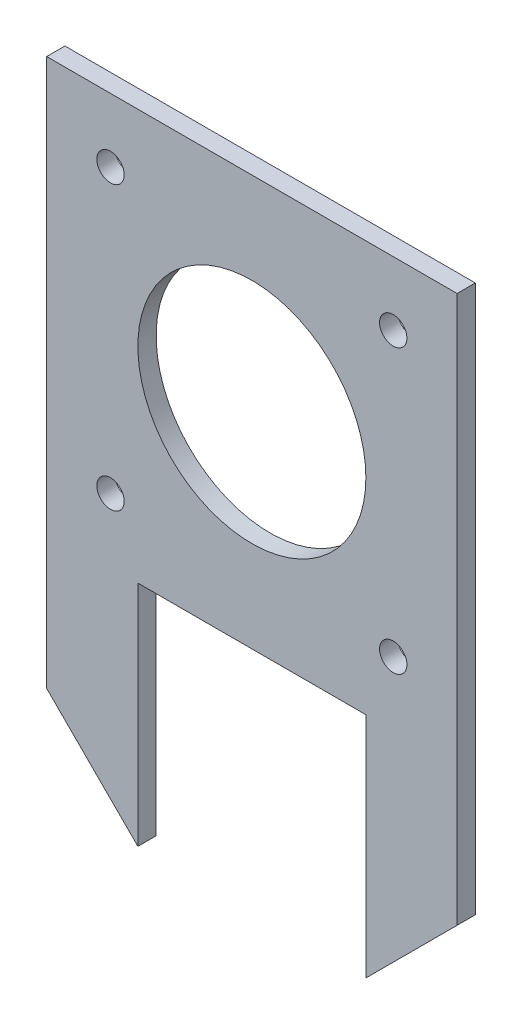
ISO-10303-21;
HEADER;
FILE_DESCRIPTION(('STEP AP214'),'2;1');
FILE_NAME('part.step','',(''),(''),'','','');
FILE_SCHEMA(('AUTOMOTIVE_DESIGN { 1 0 10303 214 1 1 1 1 }'));
ENDSEC;
DATA;
#1=APPLICATION_CONTEXT('core data for automotive mechanical design processes');
#2=APPLICATION_PROTOCOL_DEFINITION('international standard','automotive_design',2000,#1);
#3=PRODUCT_CONTEXT('',#1,'mechanical');
#4=PRODUCT('Part','Part','',(#3));
#5=PRODUCT_RELATED_PRODUCT_CATEGORY('part','',(#4));
#6=PRODUCT_DEFINITION_FORMATION('','',#4);
#7=PRODUCT_DEFINITION_CONTEXT('part definition',#1,'design');
#8=PRODUCT_DEFINITION('design','',#6,#7);
#9=PRODUCT_DEFINITION_SHAPE('','',#8);
#10=(LENGTH_UNIT() NAMED_UNIT(*) SI_UNIT(.MILLI.,.METRE.));
#11=(NAMED_UNIT(*) PLANE_ANGLE_UNIT() SI_UNIT($,.RADIAN.));
#12=(NAMED_UNIT(*) SI_UNIT($,.STERADIAN.) SOLID_ANGLE_UNIT());
#13=UNCERTAINTY_MEASURE_WITH_UNIT(LENGTH_MEASURE(1.E-05),#10,'distance_accuracy_value','');
#14=(GEOMETRIC_REPRESENTATION_CONTEXT(3) GLOBAL_UNCERTAINTY_ASSIGNED_CONTEXT((#13)) GLOBAL_UNIT_ASSIGNED_CONTEXT((#10,
#11,#12)) REPRESENTATION_CONTEXT('',''));
#15=CARTESIAN_POINT('',(0.,0.,0.));
#16=DIRECTION('',(0.,0.,1.));
#17=DIRECTION('',(1.,0.,0.));
#18=AXIS2_PLACEMENT_3D('',#15,#16,#17);
#19=CARTESIAN_POINT('',(-35.,0.,2.));
#20=DIRECTION('',(-1.,0.,0.));
#21=DIRECTION('',(0.,0.,1.));
#22=AXIS2_PLACEMENT_3D('',#19,#20,#21);
#23=PLANE('',#22);
#24=DIRECTION('',(0.,1.,0.));
#25=VECTOR('',#24,1.);
#26=CARTESIAN_POINT('',(-35.,0.,0.));
#27=LINE('',#26,#25);
#28=CARTESIAN_POINT('',(-35.,9.99999999999997,0.));
#29=VERTEX_POINT('',#28);
#30=CARTESIAN_POINT('',(-35.,70.,0.));
#31=VERTEX_POINT('',#30);
#32=EDGE_CURVE('E144',#29,#31,#27,.T.);
#33=ORIENTED_EDGE('',*,*,#32,.F.);
#34=DIRECTION('',(0.,0.,-1.));
#35=VECTOR('',#34,1.);
#36=CARTESIAN_POINT('',(-35.,9.99999999999997,2.));
#37=LINE('',#36,#35);
#38=CARTESIAN_POINT('',(-35.,9.99999999999997,2.));
#39=VERTEX_POINT('',#38);
#40=EDGE_CURVE('E11',#39,#29,#37,.T.);
#41=ORIENTED_EDGE('',*,*,#40,.F.);
#42=DIRECTION('',(0.,1.,0.));
#43=VECTOR('',#42,1.);
#44=CARTESIAN_POINT('',(-35.,0.,2.));
#45=LINE('',#44,#43);
#46=CARTESIAN_POINT('',(-35.,70.,2.));
#47=VERTEX_POINT('',#46);
#48=EDGE_CURVE('E342',#39,#47,#45,.T.);
#49=ORIENTED_EDGE('',*,*,#48,.T.);
#50=DIRECTION('',(0.,0.,-1.));
#51=VECTOR('',#50,1.);
#52=CARTESIAN_POINT('',(-35.,70.,2.));
#53=LINE('',#52,#51);
#54=EDGE_CURVE('E52',#47,#31,#53,.T.);
#55=ORIENTED_EDGE('',*,*,#54,.T.);
#56=EDGE_LOOP('',(#33,#41,#49,#55));
#57=FACE_BOUND('',#56,.T.);
#58=ADVANCED_FACE('F35',(#57),#23,.T.);
#59=CARTESIAN_POINT('',(-12.5,-12.5,2.));
#60=DIRECTION('',(-0.707106781186546,-0.707106781186549,0.));
#61=DIRECTION('',(0.707106781186549,-0.707106781186546,0.));
#62=AXIS2_PLACEMENT_3D('',#59,#60,#61);
#63=PLANE('',#62);
#64=DIRECTION('',(-0.707106781186549,0.707106781186546,0.));
#65=VECTOR('',#64,1.);
#66=CARTESIAN_POINT('',(-12.5,-12.5,0.));
#67=LINE('',#66,#65);
#68=CARTESIAN_POINT('',(-25.,0.,0.));
#69=VERTEX_POINT('',#68);
#70=EDGE_CURVE('E146',#69,#29,#67,.T.);
#71=ORIENTED_EDGE('',*,*,#70,.F.);
#72=DIRECTION('',(0.,0.,-1.));
#73=VECTOR('',#72,1.);
#74=CARTESIAN_POINT('',(-25.,0.,2.));
#75=LINE('',#74,#73);
#76=CARTESIAN_POINT('',(-25.,0.,2.));
#77=VERTEX_POINT('',#76);
#78=EDGE_CURVE('E44',#77,#69,#75,.T.);
#79=ORIENTED_EDGE('',*,*,#78,.F.);
#80=DIRECTION('',(-0.707106781186549,0.707106781186546,0.));
#81=VECTOR('',#80,1.);
#82=CARTESIAN_POINT('',(-12.5,-12.5,2.));
#83=LINE('',#82,#81);
#84=EDGE_CURVE('E185',#77,#39,#83,.T.);
#85=ORIENTED_EDGE('',*,*,#84,.T.);
#86=ORIENTED_EDGE('',*,*,#40,.T.);
#87=EDGE_LOOP('',(#71,#79,#85,#86));
#88=FACE_BOUND('',#87,.T.);
#89=ADVANCED_FACE('F184',(#88),#63,.T.);
#90=CARTESIAN_POINT('',(-25.,0.,2.));
#91=DIRECTION('',(-1.,0.,0.));
#92=DIRECTION('',(0.,0.,1.));
#93=AXIS2_PLACEMENT_3D('',#90,#91,#92);
#94=PLANE('',#93);
#95=DIRECTION('',(0.,1.,0.));
#96=VECTOR('',#95,1.);
#97=CARTESIAN_POINT('',(-25.,0.,0.));
#98=LINE('',#97,#96);
#99=CARTESIAN_POINT('',(-25.,25.,0.));
#100=VERTEX_POINT('',#99);
#101=EDGE_CURVE('E149',#69,#100,#98,.T.);
#102=ORIENTED_EDGE('',*,*,#101,.T.);
#103=DIRECTION('',(0.,0.,-1.));
#104=VECTOR('',#103,1.);
#105=CARTESIAN_POINT('',(-25.,25.,2.));
#106=LINE('',#105,#104);
#107=CARTESIAN_POINT('',(-25.,25.,2.));
#108=VERTEX_POINT('',#107);
#109=EDGE_CURVE('E170',#108,#100,#106,.T.);
#110=ORIENTED_EDGE('',*,*,#109,.F.);
#111=DIRECTION('',(0.,1.,0.));
#112=VECTOR('',#111,1.);
#113=CARTESIAN_POINT('',(-25.,0.,2.));
#114=LINE('',#113,#112);
#115=EDGE_CURVE('E176',#77,#108,#114,.T.);
#116=ORIENTED_EDGE('',*,*,#115,.F.);
#117=ORIENTED_EDGE('',*,*,#78,.T.);
#118=EDGE_LOOP('',(#102,#110,#116,#117));
#119=FACE_BOUND('',#118,.T.);
#120=ADVANCED_FACE('F174',(#119),#94,.F.);
#121=CARTESIAN_POINT('',(0.,25.,2.));
#122=DIRECTION('',(0.,-1.,0.));
#123=DIRECTION('',(1.,0.,0.));
#124=AXIS2_PLACEMENT_3D('',#121,#122,#123);
#125=PLANE('',#124);
#126=DIRECTION('',(-1.,0.,0.));
#127=VECTOR('',#126,1.);
#128=CARTESIAN_POINT('',(0.,25.,0.));
#129=LINE('',#128,#127);
#130=CARTESIAN_POINT('',(0.,25.,0.));
#131=VERTEX_POINT('',#130);
#132=EDGE_CURVE('E152',#131,#100,#129,.T.);
#133=ORIENTED_EDGE('',*,*,#132,.F.);
#134=DIRECTION('',(0.,0.,-1.));
#135=VECTOR('',#134,1.);
#136=CARTESIAN_POINT('',(0.,25.,2.));
#137=LINE('',#136,#135);
#138=CARTESIAN_POINT('',(0.,25.,2.));
#139=VERTEX_POINT('',#138);
#140=EDGE_CURVE('E168',#139,#131,#137,.T.);
#141=ORIENTED_EDGE('',*,*,#140,.F.);
#142=DIRECTION('',(-1.,0.,0.));
#143=VECTOR('',#142,1.);
#144=CARTESIAN_POINT('',(0.,25.,2.));
#145=LINE('',#144,#143);
#146=EDGE_CURVE('E337',#139,#108,#145,.T.);
#147=ORIENTED_EDGE('',*,*,#146,.T.);
#148=ORIENTED_EDGE('',*,*,#109,.T.);
#149=EDGE_LOOP('',(#133,#141,#147,#148));
#150=FACE_BOUND('',#149,.T.);
#151=ADVANCED_FACE('F304',(#150),#125,.T.);
#152=CARTESIAN_POINT('',(0.,0.,2.));
#153=DIRECTION('',(-1.,0.,0.));
#154=DIRECTION('',(0.,0.,1.));
#155=AXIS2_PLACEMENT_3D('',#152,#153,#154);
#156=PLANE('',#155);
#157=DIRECTION('',(0.,1.,0.));
#158=VECTOR('',#157,1.);
#159=CARTESIAN_POINT('',(0.,0.,0.));
#160=LINE('',#159,#158);
#161=CARTESIAN_POINT('',(0.,0.,0.));
#162=VERTEX_POINT('',#161);
#163=EDGE_CURVE('E155',#162,#131,#160,.T.);
#164=ORIENTED_EDGE('',*,*,#163,.F.);
#165=DIRECTION('',(0.,0.,-1.));
#166=VECTOR('',#165,1.);
#167=CARTESIAN_POINT('',(0.,0.,2.));
#168=LINE('',#167,#166);
#169=CARTESIAN_POINT('',(0.,0.,2.));
#170=VERTEX_POINT('',#169);
#171=EDGE_CURVE('E111',#170,#162,#168,.T.);
#172=ORIENTED_EDGE('',*,*,#171,.F.);
#173=DIRECTION('',(0.,1.,0.));
#174=VECTOR('',#173,1.);
#175=CARTESIAN_POINT('',(0.,0.,2.));
#176=LINE('',#175,#174);
#177=EDGE_CURVE('E121',#170,#139,#176,.T.);
#178=ORIENTED_EDGE('',*,*,#177,.T.);
#179=ORIENTED_EDGE('',*,*,#140,.T.);
#180=EDGE_LOOP('',(#164,#172,#178,#179));
#181=FACE_BOUND('',#180,.T.);
#182=ADVANCED_FACE('F295',(#181),#156,.T.);
#183=CARTESIAN_POINT('',(0.,0.,2.));
#184=DIRECTION('',(0.707106781186551,-0.707106781186544,0.));
#185=DIRECTION('',(0.707106781186544,0.707106781186551,0.));
#186=AXIS2_PLACEMENT_3D('',#183,#184,#185);
#187=PLANE('',#186);
#188=DIRECTION('',(-0.707106781186544,-0.707106781186551,0.));
#189=VECTOR('',#188,1.);
#190=CARTESIAN_POINT('',(0.,0.,0.));
#191=LINE('',#190,#189);
#192=CARTESIAN_POINT('',(10.,10.0000000000001,0.));
#193=VERTEX_POINT('',#192);
#194=EDGE_CURVE('E107',#193,#162,#191,.T.);
#195=ORIENTED_EDGE('',*,*,#194,.F.);
#196=DIRECTION('',(0.,0.,-1.));
#197=VECTOR('',#196,1.);
#198=CARTESIAN_POINT('',(10.,10.0000000000001,2.));
#199=LINE('',#198,#197);
#200=CARTESIAN_POINT('',(10.,10.0000000000001,2.));
#201=VERTEX_POINT('',#200);
#202=EDGE_CURVE('E102',#201,#193,#199,.T.);
#203=ORIENTED_EDGE('',*,*,#202,.F.);
#204=DIRECTION('',(-0.707106781186544,-0.707106781186551,0.));
#205=VECTOR('',#204,1.);
#206=CARTESIAN_POINT('',(0.,0.,2.));
#207=LINE('',#206,#205);
#208=EDGE_CURVE('E105',#201,#170,#207,.T.);
#209=ORIENTED_EDGE('',*,*,#208,.T.);
#210=ORIENTED_EDGE('',*,*,#171,.T.);
#211=EDGE_LOOP('',(#195,#203,#209,#210));
#212=FACE_BOUND('',#211,.T.);
#213=ADVANCED_FACE('F104',(#212),#187,.T.);
#214=CARTESIAN_POINT('',(10.,0.,2.));
#215=DIRECTION('',(1.,0.,0.));
#216=DIRECTION('',(0.,1.,0.));
#217=AXIS2_PLACEMENT_3D('',#214,#215,#216);
#218=PLANE('',#217);
#219=DIRECTION('',(0.,-1.,0.));
#220=VECTOR('',#219,1.);
#221=CARTESIAN_POINT('',(10.,0.,0.));
#222=LINE('',#221,#220);
#223=CARTESIAN_POINT('',(9.99999999999999,70.,0.));
#224=VERTEX_POINT('',#223);
#225=EDGE_CURVE('E159',#224,#193,#222,.T.);
#226=ORIENTED_EDGE('',*,*,#225,.F.);
#227=DIRECTION('',(0.,0.,-1.));
#228=VECTOR('',#227,1.);
#229=CARTESIAN_POINT('',(9.99999999999999,70.,2.));
#230=LINE('',#229,#228);
#231=CARTESIAN_POINT('',(9.99999999999999,70.,2.));
#232=VERTEX_POINT('',#231);
#233=EDGE_CURVE('E77',#232,#224,#230,.T.);
#234=ORIENTED_EDGE('',*,*,#233,.F.);
#235=DIRECTION('',(0.,-1.,0.));
#236=VECTOR('',#235,1.);
#237=CARTESIAN_POINT('',(10.,0.,2.));
#238=LINE('',#237,#236);
#239=EDGE_CURVE('E118',#232,#201,#238,.T.);
#240=ORIENTED_EDGE('',*,*,#239,.T.);
#241=ORIENTED_EDGE('',*,*,#202,.T.);
#242=EDGE_LOOP('',(#226,#234,#240,#241));
#243=FACE_BOUND('',#242,.T.);
#244=ADVANCED_FACE('F123',(#243),#218,.T.);
#245=CARTESIAN_POINT('',(-12.5,47.5,2.));
#246=DIRECTION('',(0.,0.,-1.));
#247=DIRECTION('',(-1.,0.,0.));
#248=AXIS2_PLACEMENT_3D('',#245,#246,#247);
#249=CYLINDRICAL_SURFACE('',#248,12.5);
#250=CARTESIAN_POINT('',(-12.5,47.5,2.));
#251=DIRECTION('',(0.,0.,1.));
#252=DIRECTION('',(1.,0.,0.));
#253=AXIS2_PLACEMENT_3D('',#250,#251,#252);
#254=CIRCLE('',#253,12.5);
#255=CARTESIAN_POINT('',(0.,47.5,2.));
#256=VERTEX_POINT('',#255);
#257=EDGE_CURVE('E344',#256,#256,#254,.T.);
#258=ORIENTED_EDGE('',*,*,#257,.T.);
#259=EDGE_LOOP('',(#258));
#260=FACE_BOUND('',#259,.T.);
#261=CARTESIAN_POINT('',(-12.5,47.5,0.));
#262=DIRECTION('',(0.,0.,1.));
#263=DIRECTION('',(1.,0.,0.));
#264=AXIS2_PLACEMENT_3D('',#261,#262,#263);
#265=CIRCLE('',#264,12.5);
#266=CARTESIAN_POINT('',(0.,47.5,0.));
#267=VERTEX_POINT('',#266);
#268=EDGE_CURVE('E141',#267,#267,#265,.T.);
#269=ORIENTED_EDGE('',*,*,#268,.F.);
#270=EDGE_LOOP('',(#269));
#271=FACE_BOUND('',#270,.T.);
#272=ADVANCED_FACE('F207',(#260,#271),#249,.F.);
#273=CARTESIAN_POINT('',(-28.,63.,2.));
#274=DIRECTION('',(0.,0.,-1.));
#275=DIRECTION('',(-1.,0.,0.));
#276=AXIS2_PLACEMENT_3D('',#273,#274,#275);
#277=CYLINDRICAL_SURFACE('',#276,1.5);
#278=CARTESIAN_POINT('',(-28.,63.,2.));
#279=DIRECTION('',(0.,0.,1.));
#280=DIRECTION('',(1.,0.,0.));
#281=AXIS2_PLACEMENT_3D('',#278,#279,#280);
#282=CIRCLE('',#281,1.5);
#283=CARTESIAN_POINT('',(-26.5,63.,2.));
#284=VERTEX_POINT('',#283);
#285=EDGE_CURVE('E347',#284,#284,#282,.T.);
#286=ORIENTED_EDGE('',*,*,#285,.T.);
#287=EDGE_LOOP('',(#286));
#288=FACE_BOUND('',#287,.T.);
#289=CARTESIAN_POINT('',(-28.,63.,0.));
#290=DIRECTION('',(0.,0.,1.));
#291=DIRECTION('',(1.,0.,0.));
#292=AXIS2_PLACEMENT_3D('',#289,#290,#291);
#293=CIRCLE('',#292,1.5);
#294=CARTESIAN_POINT('',(-26.5,63.,0.));
#295=VERTEX_POINT('',#294);
#296=EDGE_CURVE('E138',#295,#295,#293,.T.);
#297=ORIENTED_EDGE('',*,*,#296,.F.);
#298=EDGE_LOOP('',(#297));
#299=FACE_BOUND('',#298,.T.);
#300=ADVANCED_FACE('F210',(#288,#299),#277,.F.);
#301=CARTESIAN_POINT('',(3.,63.,2.));
#302=DIRECTION('',(0.,0.,-1.));
#303=DIRECTION('',(-1.,0.,0.));
#304=AXIS2_PLACEMENT_3D('',#301,#302,#303);
#305=CYLINDRICAL_SURFACE('',#304,1.5);
#306=CARTESIAN_POINT('',(3.,63.,2.));
#307=DIRECTION('',(0.,0.,1.));
#308=DIRECTION('',(1.,0.,0.));
#309=AXIS2_PLACEMENT_3D('',#306,#307,#308);
#310=CIRCLE('',#309,1.5);
#311=CARTESIAN_POINT('',(4.5,63.,2.));
#312=VERTEX_POINT('',#311);
#313=EDGE_CURVE('E350',#312,#312,#310,.T.);
#314=ORIENTED_EDGE('',*,*,#313,.T.);
#315=EDGE_LOOP('',(#314));
#316=FACE_BOUND('',#315,.T.);
#317=CARTESIAN_POINT('',(3.,63.,0.));
#318=DIRECTION('',(0.,0.,1.));
#319=DIRECTION('',(1.,0.,0.));
#320=AXIS2_PLACEMENT_3D('',#317,#318,#319);
#321=CIRCLE('',#320,1.5);
#322=CARTESIAN_POINT('',(4.5,63.,0.));
#323=VERTEX_POINT('',#322);
#324=EDGE_CURVE('E135',#323,#323,#321,.T.);
#325=ORIENTED_EDGE('',*,*,#324,.F.);
#326=EDGE_LOOP('',(#325));
#327=FACE_BOUND('',#326,.T.);
#328=ADVANCED_FACE('F214',(#316,#327),#305,.F.);
#329=CARTESIAN_POINT('',(2.99999999999999,32.,2.));
#330=DIRECTION('',(0.,0.,-1.));
#331=DIRECTION('',(-1.,0.,0.));
#332=AXIS2_PLACEMENT_3D('',#329,#330,#331);
#333=CYLINDRICAL_SURFACE('',#332,1.5);
#334=CARTESIAN_POINT('',(2.99999999999999,32.,2.));
#335=DIRECTION('',(0.,0.,1.));
#336=DIRECTION('',(1.,0.,0.));
#337=AXIS2_PLACEMENT_3D('',#334,#335,#336);
#338=CIRCLE('',#337,1.5);
#339=CARTESIAN_POINT('',(4.49999999999999,32.,2.));
#340=VERTEX_POINT('',#339);
#341=EDGE_CURVE('E225',#340,#340,#338,.T.);
#342=ORIENTED_EDGE('',*,*,#341,.T.);
#343=EDGE_LOOP('',(#342));
#344=FACE_BOUND('',#343,.T.);
#345=CARTESIAN_POINT('',(2.99999999999999,32.,0.));
#346=DIRECTION('',(0.,0.,1.));
#347=DIRECTION('',(1.,0.,0.));
#348=AXIS2_PLACEMENT_3D('',#345,#346,#347);
#349=CIRCLE('',#348,1.5);
#350=CARTESIAN_POINT('',(4.49999999999999,32.,0.));
#351=VERTEX_POINT('',#350);
#352=EDGE_CURVE('E132',#351,#351,#349,.T.);
#353=ORIENTED_EDGE('',*,*,#352,.F.);
#354=EDGE_LOOP('',(#353));
#355=FACE_BOUND('',#354,.T.);
#356=ADVANCED_FACE('F195',(#344,#355),#333,.F.);
#357=CARTESIAN_POINT('',(-28.,32.,2.));
#358=DIRECTION('',(0.,0.,-1.));
#359=DIRECTION('',(-1.,0.,0.));
#360=AXIS2_PLACEMENT_3D('',#357,#358,#359);
#361=CYLINDRICAL_SURFACE('',#360,1.5);
#362=CARTESIAN_POINT('',(-28.,32.,2.));
#363=DIRECTION('',(0.,0.,1.));
#364=DIRECTION('',(1.,0.,0.));
#365=AXIS2_PLACEMENT_3D('',#362,#363,#364);
#366=CIRCLE('',#365,1.5);
#367=CARTESIAN_POINT('',(-26.5,32.,2.));
#368=VERTEX_POINT('',#367);
#369=EDGE_CURVE('E164',#368,#368,#366,.T.);
#370=ORIENTED_EDGE('',*,*,#369,.T.);
#371=EDGE_LOOP('',(#370));
#372=FACE_BOUND('',#371,.T.);
#373=CARTESIAN_POINT('',(-28.,32.,0.));
#374=DIRECTION('',(0.,0.,1.));
#375=DIRECTION('',(1.,0.,0.));
#376=AXIS2_PLACEMENT_3D('',#373,#374,#375);
#377=CIRCLE('',#376,1.5);
#378=CARTESIAN_POINT('',(-26.5,32.,0.));
#379=VERTEX_POINT('',#378);
#380=EDGE_CURVE('E129',#379,#379,#377,.T.);
#381=ORIENTED_EDGE('',*,*,#380,.F.);
#382=EDGE_LOOP('',(#381));
#383=FACE_BOUND('',#382,.T.);
#384=ADVANCED_FACE('F37',(#372,#383),#361,.F.);
#385=CARTESIAN_POINT('',(0.,70.,2.));
#386=DIRECTION('',(0.,1.,0.));
#387=DIRECTION('',(0.,0.,1.));
#388=AXIS2_PLACEMENT_3D('',#385,#386,#387);
#389=PLANE('',#388);
#390=DIRECTION('',(1.,0.,0.));
#391=VECTOR('',#390,1.);
#392=CARTESIAN_POINT('',(0.,70.,0.));
#393=LINE('',#392,#391);
#394=EDGE_CURVE('E161',#31,#224,#393,.T.);
#395=ORIENTED_EDGE('',*,*,#394,.F.);
#396=ORIENTED_EDGE('',*,*,#54,.F.);
#397=DIRECTION('',(1.,0.,0.));
#398=VECTOR('',#397,1.);
#399=CARTESIAN_POINT('',(0.,70.,2.));
#400=LINE('',#399,#398);
#401=EDGE_CURVE('E124',#47,#232,#400,.T.);
#402=ORIENTED_EDGE('',*,*,#401,.T.);
#403=ORIENTED_EDGE('',*,*,#233,.T.);
#404=EDGE_LOOP('',(#395,#396,#402,#403));
#405=FACE_BOUND('',#404,.T.);
#406=ADVANCED_FACE('F186',(#405),#389,.T.);
#407=CARTESIAN_POINT('',(0.,0.,2.));
#408=DIRECTION('',(0.,0.,1.));
#409=DIRECTION('',(1.,0.,0.));
#410=AXIS2_PLACEMENT_3D('',#407,#408,#409);
#411=PLANE('',#410);
#412=ORIENTED_EDGE('',*,*,#369,.F.);
#413=EDGE_LOOP('',(#412));
#414=FACE_BOUND('',#413,.T.);
#415=ORIENTED_EDGE('',*,*,#341,.F.);
#416=EDGE_LOOP('',(#415));
#417=FACE_BOUND('',#416,.T.);
#418=ORIENTED_EDGE('',*,*,#313,.F.);
#419=EDGE_LOOP('',(#418));
#420=FACE_BOUND('',#419,.T.);
#421=ORIENTED_EDGE('',*,*,#285,.F.);
#422=EDGE_LOOP('',(#421));
#423=FACE_BOUND('',#422,.T.);
#424=ORIENTED_EDGE('',*,*,#257,.F.);
#425=EDGE_LOOP('',(#424));
#426=FACE_BOUND('',#425,.T.);
#427=ORIENTED_EDGE('',*,*,#48,.F.);
#428=ORIENTED_EDGE('',*,*,#84,.F.);
#429=ORIENTED_EDGE('',*,*,#115,.T.);
#430=ORIENTED_EDGE('',*,*,#146,.F.);
#431=ORIENTED_EDGE('',*,*,#177,.F.);
#432=ORIENTED_EDGE('',*,*,#208,.F.);
#433=ORIENTED_EDGE('',*,*,#239,.F.);
#434=ORIENTED_EDGE('',*,*,#401,.F.);
#435=EDGE_LOOP('',(#427,#428,#429,#430,#431,#432,#433,#434));
#436=FACE_BOUND('',#435,.T.);
#437=ADVANCED_FACE('F116',(#414,#417,#420,#423,#426,#436),#411,.T.);
#438=CARTESIAN_POINT('',(0.,0.,0.));
#439=DIRECTION('',(0.,0.,1.));
#440=DIRECTION('',(1.,0.,0.));
#441=AXIS2_PLACEMENT_3D('',#438,#439,#440);
#442=PLANE('',#441);
#443=ORIENTED_EDGE('',*,*,#380,.T.);
#444=EDGE_LOOP('',(#443));
#445=FACE_BOUND('',#444,.T.);
#446=ORIENTED_EDGE('',*,*,#352,.T.);
#447=EDGE_LOOP('',(#446));
#448=FACE_BOUND('',#447,.T.);
#449=ORIENTED_EDGE('',*,*,#324,.T.);
#450=EDGE_LOOP('',(#449));
#451=FACE_BOUND('',#450,.T.);
#452=ORIENTED_EDGE('',*,*,#296,.T.);
#453=EDGE_LOOP('',(#452));
#454=FACE_BOUND('',#453,.T.);
#455=ORIENTED_EDGE('',*,*,#268,.T.);
#456=EDGE_LOOP('',(#455));
#457=FACE_BOUND('',#456,.T.);
#458=ORIENTED_EDGE('',*,*,#32,.T.);
#459=ORIENTED_EDGE('',*,*,#394,.T.);
#460=ORIENTED_EDGE('',*,*,#225,.T.);
#461=ORIENTED_EDGE('',*,*,#194,.T.);
#462=ORIENTED_EDGE('',*,*,#163,.T.);
#463=ORIENTED_EDGE('',*,*,#132,.T.);
#464=ORIENTED_EDGE('',*,*,#101,.F.);
#465=ORIENTED_EDGE('',*,*,#70,.T.);
#466=EDGE_LOOP('',(#458,#459,#460,#461,#462,#463,#464,#465));
#467=FACE_BOUND('',#466,.T.);
#468=ADVANCED_FACE('F182',(#445,#448,#451,#454,#457,#467),#442,.F.);
#469=CLOSED_SHELL('',(#58,#89,#120,#151,#182,#213,#244,#272,#300,#328,#356,#384,#406,#437,#468));
#470=MANIFOLD_SOLID_BREP('B2',#469);
#471=ADVANCED_BREP_SHAPE_REPRESENTATION('',(#18,#470),#14);
#472=SHAPE_DEFINITION_REPRESENTATION(#9,#471);
ENDSEC;
END-ISO-10303-21;
